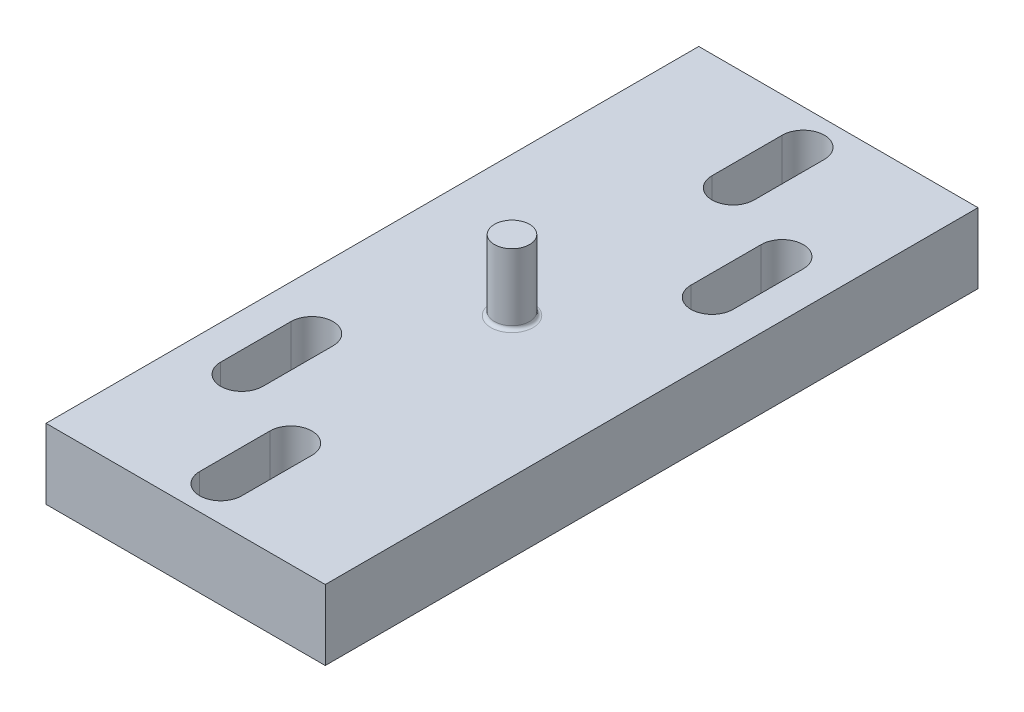
ISO-10303-21;
HEADER;
FILE_DESCRIPTION(('STEP AP214'),'2;1');
FILE_NAME('part.step','',(''),(''),'','','');
FILE_SCHEMA(('AUTOMOTIVE_DESIGN { 1 0 10303 214 1 1 1 1 }'));
ENDSEC;
DATA;
#1=APPLICATION_CONTEXT('core data for automotive mechanical design processes');
#2=APPLICATION_PROTOCOL_DEFINITION('international standard','automotive_design',2000,#1);
#3=PRODUCT_CONTEXT('',#1,'mechanical');
#4=PRODUCT('Part','Part','',(#3));
#5=PRODUCT_RELATED_PRODUCT_CATEGORY('part','',(#4));
#6=PRODUCT_DEFINITION_FORMATION('','',#4);
#7=PRODUCT_DEFINITION_CONTEXT('part definition',#1,'design');
#8=PRODUCT_DEFINITION('design','',#6,#7);
#9=PRODUCT_DEFINITION_SHAPE('','',#8);
#10=(LENGTH_UNIT() NAMED_UNIT(*) SI_UNIT(.MILLI.,.METRE.));
#11=(NAMED_UNIT(*) PLANE_ANGLE_UNIT() SI_UNIT($,.RADIAN.));
#12=(NAMED_UNIT(*) SI_UNIT($,.STERADIAN.) SOLID_ANGLE_UNIT());
#13=UNCERTAINTY_MEASURE_WITH_UNIT(LENGTH_MEASURE(1.E-05),#10,'distance_accuracy_value','');
#14=(GEOMETRIC_REPRESENTATION_CONTEXT(3) GLOBAL_UNCERTAINTY_ASSIGNED_CONTEXT((#13)) GLOBAL_UNIT_ASSIGNED_CONTEXT((#10,
#11,#12)) REPRESENTATION_CONTEXT('',''));
#15=CARTESIAN_POINT('',(0.,0.,0.));
#16=DIRECTION('',(0.,0.,1.));
#17=DIRECTION('',(1.,0.,0.));
#18=AXIS2_PLACEMENT_3D('',#15,#16,#17);
#19=CARTESIAN_POINT('',(0.,10.,-73.));
#20=DIRECTION('',(0.,1.,0.));
#21=DIRECTION('',(0.,0.,1.));
#22=AXIS2_PLACEMENT_3D('',#19,#20,#21);
#23=PLANE('',#22);
#24=CARTESIAN_POINT('',(0.,10.,-31.5));
#25=DIRECTION('',(0.,1.,0.));
#26=DIRECTION('',(0.,0.,1.));
#27=AXIS2_PLACEMENT_3D('',#24,#25,#26);
#28=CIRCLE('',#27,3.);
#29=CARTESIAN_POINT('',(0.,10.,-28.5));
#30=VERTEX_POINT('',#29);
#31=EDGE_CURVE('E11',#30,#30,#28,.F.);
#32=ORIENTED_EDGE('',*,*,#31,.T.);
#33=EDGE_LOOP('',(#32));
#34=FACE_BOUND('',#33,.T.);
#35=CARTESIAN_POINT('',(0.,10.,-73.));
#36=DIRECTION('',(0.,1.,0.));
#37=DIRECTION('',(0.,0.,1.));
#38=AXIS2_PLACEMENT_3D('',#35,#36,#37);
#39=CIRCLE('',#38,3.);
#40=CARTESIAN_POINT('',(3.00000000000005,10.,-73.));
#41=VERTEX_POINT('',#40);
#42=CARTESIAN_POINT('',(-3.00000000000006,10.,-73.));
#43=VERTEX_POINT('',#42);
#44=EDGE_CURVE('E280',#41,#43,#39,.T.);
#45=ORIENTED_EDGE('',*,*,#44,.F.);
#46=DIRECTION('',(0.,0.,1.));
#47=VECTOR('',#46,1.);
#48=CARTESIAN_POINT('',(3.00000000000005,10.,-73.));
#49=LINE('',#48,#47);
#50=CARTESIAN_POINT('',(3.,10.,-63.));
#51=VERTEX_POINT('',#50);
#52=EDGE_CURVE('E249',#41,#51,#49,.T.);
#53=ORIENTED_EDGE('',*,*,#52,.T.);
#54=CARTESIAN_POINT('',(0.,10.,-63.));
#55=DIRECTION('',(0.,1.,0.));
#56=DIRECTION('',(0.,0.,1.));
#57=AXIS2_PLACEMENT_3D('',#54,#55,#56);
#58=CIRCLE('',#57,3.);
#59=CARTESIAN_POINT('',(-3.00000000000001,10.,-63.));
#60=VERTEX_POINT('',#59);
#61=EDGE_CURVE('E287',#60,#51,#58,.T.);
#62=ORIENTED_EDGE('',*,*,#61,.F.);
#63=DIRECTION('',(0.,0.,1.));
#64=VECTOR('',#63,1.);
#65=CARTESIAN_POINT('',(-3.00000000000006,10.,-73.));
#66=LINE('',#65,#64);
#67=EDGE_CURVE('E284',#43,#60,#66,.T.);
#68=ORIENTED_EDGE('',*,*,#67,.F.);
#69=EDGE_LOOP('',(#45,#53,#62,#68));
#70=FACE_BOUND('',#69,.T.);
#71=CARTESIAN_POINT('',(0.,10.,0.));
#72=DIRECTION('',(0.,1.,0.));
#73=DIRECTION('',(0.,0.,1.));
#74=AXIS2_PLACEMENT_3D('',#71,#72,#73);
#75=CIRCLE('',#74,3.);
#76=CARTESIAN_POINT('',(3.,10.,0.));
#77=VERTEX_POINT('',#76);
#78=CARTESIAN_POINT('',(-3.,10.,0.));
#79=VERTEX_POINT('',#78);
#80=EDGE_CURVE('E289',#77,#79,#75,.T.);
#81=ORIENTED_EDGE('',*,*,#80,.F.);
#82=DIRECTION('',(0.,0.,1.));
#83=VECTOR('',#82,1.);
#84=CARTESIAN_POINT('',(3.,10.,0.));
#85=LINE('',#84,#83);
#86=CARTESIAN_POINT('',(3.00000000000006,10.,10.));
#87=VERTEX_POINT('',#86);
#88=EDGE_CURVE('E245',#77,#87,#85,.T.);
#89=ORIENTED_EDGE('',*,*,#88,.T.);
#90=CARTESIAN_POINT('',(0.,10.,10.));
#91=DIRECTION('',(0.,1.,0.));
#92=DIRECTION('',(0.,0.,1.));
#93=AXIS2_PLACEMENT_3D('',#90,#91,#92);
#94=CIRCLE('',#93,3.);
#95=CARTESIAN_POINT('',(-3.00000000000006,10.,10.));
#96=VERTEX_POINT('',#95);
#97=EDGE_CURVE('E295',#96,#87,#94,.T.);
#98=ORIENTED_EDGE('',*,*,#97,.F.);
#99=DIRECTION('',(0.,0.,1.));
#100=VECTOR('',#99,1.);
#101=CARTESIAN_POINT('',(-3.,10.,0.));
#102=LINE('',#101,#100);
#103=EDGE_CURVE('E292',#79,#96,#102,.T.);
#104=ORIENTED_EDGE('',*,*,#103,.F.);
#105=EDGE_LOOP('',(#81,#89,#98,#104));
#106=FACE_BOUND('',#105,.T.);
#107=DIRECTION('',(1.,0.,0.));
#108=VECTOR('',#107,1.);
#109=CARTESIAN_POINT('',(-19.8937990848772,10.,-78.));
#110=LINE('',#109,#108);
#111=CARTESIAN_POINT('',(-19.8937990848772,10.,-78.));
#112=VERTEX_POINT('',#111);
#113=CARTESIAN_POINT('',(19.8937990848772,10.,-78.));
#114=VERTEX_POINT('',#113);
#115=EDGE_CURVE('E278',#112,#114,#110,.T.);
#116=ORIENTED_EDGE('',*,*,#115,.F.);
#117=DIRECTION('',(0.,0.,1.));
#118=VECTOR('',#117,1.);
#119=CARTESIAN_POINT('',(-19.8937990848772,10.,-78.));
#120=LINE('',#119,#118);
#121=CARTESIAN_POINT('',(-19.8937990848772,10.,15.));
#122=VERTEX_POINT('',#121);
#123=EDGE_CURVE('E299',#112,#122,#120,.T.);
#124=ORIENTED_EDGE('',*,*,#123,.T.);
#125=DIRECTION('',(1.,0.,0.));
#126=VECTOR('',#125,1.);
#127=CARTESIAN_POINT('',(-19.8937990848772,10.,15.));
#128=LINE('',#127,#126);
#129=CARTESIAN_POINT('',(19.8937990848772,10.,15.));
#130=VERTEX_POINT('',#129);
#131=EDGE_CURVE('E297',#122,#130,#128,.T.);
#132=ORIENTED_EDGE('',*,*,#131,.T.);
#133=DIRECTION('',(0.,0.,1.));
#134=VECTOR('',#133,1.);
#135=CARTESIAN_POINT('',(19.8937990848772,10.,-78.));
#136=LINE('',#135,#134);
#137=EDGE_CURVE('E242',#114,#130,#136,.T.);
#138=ORIENTED_EDGE('',*,*,#137,.F.);
#139=EDGE_LOOP('',(#116,#124,#132,#138));
#140=FACE_BOUND('',#139,.T.);
#141=DIRECTION('',(0.,0.,-1.));
#142=VECTOR('',#141,1.);
#143=CARTESIAN_POINT('',(15.,10.,-48.));
#144=LINE('',#143,#142);
#145=CARTESIAN_POINT('',(15.,10.,-48.));
#146=VERTEX_POINT('',#145);
#147=CARTESIAN_POINT('',(15.0000000000001,10.,-58.));
#148=VERTEX_POINT('',#147);
#149=EDGE_CURVE('E215',#146,#148,#144,.T.);
#150=ORIENTED_EDGE('',*,*,#149,.F.);
#151=CARTESIAN_POINT('',(12.,10.,-48.));
#152=DIRECTION('',(0.,1.,0.));
#153=DIRECTION('',(0.,0.,1.));
#154=AXIS2_PLACEMENT_3D('',#151,#152,#153);
#155=CIRCLE('',#154,3.);
#156=CARTESIAN_POINT('',(9.,10.,-48.));
#157=VERTEX_POINT('',#156);
#158=EDGE_CURVE('E213',#157,#146,#155,.T.);
#159=ORIENTED_EDGE('',*,*,#158,.F.);
#160=DIRECTION('',(0.,0.,1.));
#161=VECTOR('',#160,1.);
#162=CARTESIAN_POINT('',(9.,10.,-48.));
#163=LINE('',#162,#161);
#164=CARTESIAN_POINT('',(9.00000000000005,10.,-58.));
#165=VERTEX_POINT('',#164);
#166=EDGE_CURVE('E220',#165,#157,#163,.T.);
#167=ORIENTED_EDGE('',*,*,#166,.F.);
#168=CARTESIAN_POINT('',(12.0000000000001,10.,-58.));
#169=DIRECTION('',(0.,1.,0.));
#170=DIRECTION('',(0.,0.,1.));
#171=AXIS2_PLACEMENT_3D('',#168,#169,#170);
#172=CIRCLE('',#171,3.);
#173=EDGE_CURVE('E218',#148,#165,#172,.T.);
#174=ORIENTED_EDGE('',*,*,#173,.F.);
#175=EDGE_LOOP('',(#150,#159,#167,#174));
#176=FACE_BOUND('',#175,.T.);
#177=DIRECTION('',(0.,0.,1.));
#178=VECTOR('',#177,1.);
#179=CARTESIAN_POINT('',(-15.,10.,-15.));
#180=LINE('',#179,#178);
#181=CARTESIAN_POINT('',(-15.,10.,-15.));
#182=VERTEX_POINT('',#181);
#183=CARTESIAN_POINT('',(-15.0000000000001,10.,-5.));
#184=VERTEX_POINT('',#183);
#185=EDGE_CURVE('E182',#182,#184,#180,.T.);
#186=ORIENTED_EDGE('',*,*,#185,.F.);
#187=CARTESIAN_POINT('',(-12.,10.,-15.));
#188=DIRECTION('',(0.,1.,0.));
#189=DIRECTION('',(0.,0.,1.));
#190=AXIS2_PLACEMENT_3D('',#187,#188,#189);
#191=CIRCLE('',#190,3.);
#192=CARTESIAN_POINT('',(-9.00000000000001,10.,-15.));
#193=VERTEX_POINT('',#192);
#194=EDGE_CURVE('E172',#193,#182,#191,.T.);
#195=ORIENTED_EDGE('',*,*,#194,.F.);
#196=DIRECTION('',(0.,0.,-1.));
#197=VECTOR('',#196,1.);
#198=CARTESIAN_POINT('',(-9.00000000000001,10.,-15.));
#199=LINE('',#198,#197);
#200=CARTESIAN_POINT('',(-9.00000000000007,10.,-5.));
#201=VERTEX_POINT('',#200);
#202=EDGE_CURVE('E196',#201,#193,#199,.T.);
#203=ORIENTED_EDGE('',*,*,#202,.F.);
#204=CARTESIAN_POINT('',(-12.0000000000001,10.,-5.));
#205=DIRECTION('',(0.,1.,0.));
#206=DIRECTION('',(0.,0.,1.));
#207=AXIS2_PLACEMENT_3D('',#204,#205,#206);
#208=CIRCLE('',#207,3.);
#209=EDGE_CURVE('E194',#184,#201,#208,.T.);
#210=ORIENTED_EDGE('',*,*,#209,.F.);
#211=EDGE_LOOP('',(#186,#195,#203,#210));
#212=FACE_BOUND('',#211,.T.);
#213=ADVANCED_FACE('F34',(#34,#70,#106,#140,#176,#212),#23,.T.);
#214=CARTESIAN_POINT('',(0.,0.,-73.));
#215=DIRECTION('',(0.,1.,0.));
#216=DIRECTION('',(0.,0.,1.));
#217=AXIS2_PLACEMENT_3D('',#214,#215,#216);
#218=PLANE('',#217);
#219=CARTESIAN_POINT('',(12.,0.,-48.));
#220=DIRECTION('',(0.,1.,0.));
#221=DIRECTION('',(0.,0.,1.));
#222=AXIS2_PLACEMENT_3D('',#219,#220,#221);
#223=CIRCLE('',#222,3.);
#224=CARTESIAN_POINT('',(9.,0.,-48.));
#225=VERTEX_POINT('',#224);
#226=CARTESIAN_POINT('',(15.,0.,-48.));
#227=VERTEX_POINT('',#226);
#228=EDGE_CURVE('E223',#225,#227,#223,.T.);
#229=ORIENTED_EDGE('',*,*,#228,.T.);
#230=DIRECTION('',(0.,0.,-1.));
#231=VECTOR('',#230,1.);
#232=CARTESIAN_POINT('',(15.,0.,-48.));
#233=LINE('',#232,#231);
#234=CARTESIAN_POINT('',(15.0000000000001,0.,-58.));
#235=VERTEX_POINT('',#234);
#236=EDGE_CURVE('E226',#227,#235,#233,.T.);
#237=ORIENTED_EDGE('',*,*,#236,.T.);
#238=CARTESIAN_POINT('',(12.0000000000001,0.,-58.));
#239=DIRECTION('',(0.,1.,0.));
#240=DIRECTION('',(0.,0.,1.));
#241=AXIS2_PLACEMENT_3D('',#238,#239,#240);
#242=CIRCLE('',#241,3.);
#243=CARTESIAN_POINT('',(9.00000000000005,0.,-58.));
#244=VERTEX_POINT('',#243);
#245=EDGE_CURVE('E230',#235,#244,#242,.T.);
#246=ORIENTED_EDGE('',*,*,#245,.T.);
#247=DIRECTION('',(0.,0.,1.));
#248=VECTOR('',#247,1.);
#249=CARTESIAN_POINT('',(9.,0.,-48.));
#250=LINE('',#249,#248);
#251=EDGE_CURVE('E216',#244,#225,#250,.T.);
#252=ORIENTED_EDGE('',*,*,#251,.T.);
#253=EDGE_LOOP('',(#229,#237,#246,#252));
#254=FACE_BOUND('',#253,.T.);
#255=DIRECTION('',(0.,0.,1.));
#256=VECTOR('',#255,1.);
#257=CARTESIAN_POINT('',(3.00000000000005,0.,-73.));
#258=LINE('',#257,#256);
#259=CARTESIAN_POINT('',(3.00000000000005,0.,-73.));
#260=VERTEX_POINT('',#259);
#261=CARTESIAN_POINT('',(3.,0.,-63.));
#262=VERTEX_POINT('',#261);
#263=EDGE_CURVE('E246',#260,#262,#258,.T.);
#264=ORIENTED_EDGE('',*,*,#263,.F.);
#265=CARTESIAN_POINT('',(0.,0.,-73.));
#266=DIRECTION('',(0.,1.,0.));
#267=DIRECTION('',(0.,0.,1.));
#268=AXIS2_PLACEMENT_3D('',#265,#266,#267);
#269=CIRCLE('',#268,3.);
#270=CARTESIAN_POINT('',(-3.00000000000006,0.,-73.));
#271=VERTEX_POINT('',#270);
#272=EDGE_CURVE('E303',#260,#271,#269,.T.);
#273=ORIENTED_EDGE('',*,*,#272,.T.);
#274=DIRECTION('',(0.,0.,1.));
#275=VECTOR('',#274,1.);
#276=CARTESIAN_POINT('',(-3.00000000000006,0.,-73.));
#277=LINE('',#276,#275);
#278=CARTESIAN_POINT('',(-3.00000000000001,0.,-63.));
#279=VERTEX_POINT('',#278);
#280=EDGE_CURVE('E306',#271,#279,#277,.T.);
#281=ORIENTED_EDGE('',*,*,#280,.T.);
#282=CARTESIAN_POINT('',(0.,0.,-63.));
#283=DIRECTION('',(0.,1.,0.));
#284=DIRECTION('',(0.,0.,1.));
#285=AXIS2_PLACEMENT_3D('',#282,#283,#284);
#286=CIRCLE('',#285,3.);
#287=EDGE_CURVE('E309',#279,#262,#286,.T.);
#288=ORIENTED_EDGE('',*,*,#287,.T.);
#289=EDGE_LOOP('',(#264,#273,#281,#288));
#290=FACE_BOUND('',#289,.T.);
#291=DIRECTION('',(0.,0.,1.));
#292=VECTOR('',#291,1.);
#293=CARTESIAN_POINT('',(3.,0.,0.));
#294=LINE('',#293,#292);
#295=CARTESIAN_POINT('',(3.,0.,0.));
#296=VERTEX_POINT('',#295);
#297=CARTESIAN_POINT('',(3.00000000000006,0.,10.));
#298=VERTEX_POINT('',#297);
#299=EDGE_CURVE('E255',#296,#298,#294,.T.);
#300=ORIENTED_EDGE('',*,*,#299,.F.);
#301=CARTESIAN_POINT('',(0.,0.,0.));
#302=DIRECTION('',(0.,1.,0.));
#303=DIRECTION('',(0.,0.,1.));
#304=AXIS2_PLACEMENT_3D('',#301,#302,#303);
#305=CIRCLE('',#304,3.);
#306=CARTESIAN_POINT('',(-3.,0.,0.));
#307=VERTEX_POINT('',#306);
#308=EDGE_CURVE('E311',#296,#307,#305,.T.);
#309=ORIENTED_EDGE('',*,*,#308,.T.);
#310=DIRECTION('',(0.,0.,1.));
#311=VECTOR('',#310,1.);
#312=CARTESIAN_POINT('',(-3.,0.,0.));
#313=LINE('',#312,#311);
#314=CARTESIAN_POINT('',(-3.00000000000006,0.,10.));
#315=VERTEX_POINT('',#314);
#316=EDGE_CURVE('E314',#307,#315,#313,.T.);
#317=ORIENTED_EDGE('',*,*,#316,.T.);
#318=CARTESIAN_POINT('',(0.,0.,10.));
#319=DIRECTION('',(0.,1.,0.));
#320=DIRECTION('',(0.,0.,1.));
#321=AXIS2_PLACEMENT_3D('',#318,#319,#320);
#322=CIRCLE('',#321,3.);
#323=EDGE_CURVE('E317',#315,#298,#322,.T.);
#324=ORIENTED_EDGE('',*,*,#323,.T.);
#325=EDGE_LOOP('',(#300,#309,#317,#324));
#326=FACE_BOUND('',#325,.T.);
#327=DIRECTION('',(1.,0.,0.));
#328=VECTOR('',#327,1.);
#329=CARTESIAN_POINT('',(-19.8937990848772,0.,-78.));
#330=LINE('',#329,#328);
#331=CARTESIAN_POINT('',(-19.8937990848772,0.,-78.));
#332=VERTEX_POINT('',#331);
#333=CARTESIAN_POINT('',(19.8937990848772,0.,-78.));
#334=VERTEX_POINT('',#333);
#335=EDGE_CURVE('E263',#332,#334,#330,.T.);
#336=ORIENTED_EDGE('',*,*,#335,.T.);
#337=DIRECTION('',(0.,0.,1.));
#338=VECTOR('',#337,1.);
#339=CARTESIAN_POINT('',(19.8937990848772,0.,-78.));
#340=LINE('',#339,#338);
#341=CARTESIAN_POINT('',(19.8937990848772,0.,15.));
#342=VERTEX_POINT('',#341);
#343=EDGE_CURVE('E190',#334,#342,#340,.T.);
#344=ORIENTED_EDGE('',*,*,#343,.T.);
#345=DIRECTION('',(1.,0.,0.));
#346=VECTOR('',#345,1.);
#347=CARTESIAN_POINT('',(-19.8937990848772,0.,15.));
#348=LINE('',#347,#346);
#349=CARTESIAN_POINT('',(-19.8937990848772,0.,15.));
#350=VERTEX_POINT('',#349);
#351=EDGE_CURVE('E319',#350,#342,#348,.T.);
#352=ORIENTED_EDGE('',*,*,#351,.F.);
#353=DIRECTION('',(0.,0.,1.));
#354=VECTOR('',#353,1.);
#355=CARTESIAN_POINT('',(-19.8937990848772,0.,-78.));
#356=LINE('',#355,#354);
#357=EDGE_CURVE('E281',#332,#350,#356,.T.);
#358=ORIENTED_EDGE('',*,*,#357,.F.);
#359=EDGE_LOOP('',(#336,#344,#352,#358));
#360=FACE_BOUND('',#359,.T.);
#361=CARTESIAN_POINT('',(-12.,0.,-15.));
#362=DIRECTION('',(0.,1.,0.));
#363=DIRECTION('',(0.,0.,1.));
#364=AXIS2_PLACEMENT_3D('',#361,#362,#363);
#365=CIRCLE('',#364,3.);
#366=CARTESIAN_POINT('',(-9.00000000000001,0.,-15.));
#367=VERTEX_POINT('',#366);
#368=CARTESIAN_POINT('',(-15.,0.,-15.));
#369=VERTEX_POINT('',#368);
#370=EDGE_CURVE('E201',#367,#369,#365,.T.);
#371=ORIENTED_EDGE('',*,*,#370,.T.);
#372=DIRECTION('',(0.,0.,1.));
#373=VECTOR('',#372,1.);
#374=CARTESIAN_POINT('',(-15.,0.,-15.));
#375=LINE('',#374,#373);
#376=CARTESIAN_POINT('',(-15.0000000000001,0.,-5.));
#377=VERTEX_POINT('',#376);
#378=EDGE_CURVE('E189',#369,#377,#375,.T.);
#379=ORIENTED_EDGE('',*,*,#378,.T.);
#380=CARTESIAN_POINT('',(-12.0000000000001,0.,-5.));
#381=DIRECTION('',(0.,1.,0.));
#382=DIRECTION('',(0.,0.,1.));
#383=AXIS2_PLACEMENT_3D('',#380,#381,#382);
#384=CIRCLE('',#383,3.);
#385=CARTESIAN_POINT('',(-9.00000000000007,0.,-5.));
#386=VERTEX_POINT('',#385);
#387=EDGE_CURVE('E205',#377,#386,#384,.T.);
#388=ORIENTED_EDGE('',*,*,#387,.T.);
#389=DIRECTION('',(0.,0.,-1.));
#390=VECTOR('',#389,1.);
#391=CARTESIAN_POINT('',(-9.00000000000001,0.,-15.));
#392=LINE('',#391,#390);
#393=EDGE_CURVE('E183',#386,#367,#392,.T.);
#394=ORIENTED_EDGE('',*,*,#393,.T.);
#395=EDGE_LOOP('',(#371,#379,#388,#394));
#396=FACE_BOUND('',#395,.T.);
#397=ADVANCED_FACE('F349',(#254,#290,#326,#360,#396),#218,.F.);
#398=CARTESIAN_POINT('',(-19.8937990848772,10.,-78.));
#399=DIRECTION('',(0.,0.,-1.));
#400=DIRECTION('',(-1.,0.,0.));
#401=AXIS2_PLACEMENT_3D('',#398,#399,#400);
#402=PLANE('',#401);
#403=ORIENTED_EDGE('',*,*,#335,.F.);
#404=DIRECTION('',(0.,-1.,0.));
#405=VECTOR('',#404,1.);
#406=CARTESIAN_POINT('',(-19.8937990848772,10.,-78.));
#407=LINE('',#406,#405);
#408=EDGE_CURVE('E322',#112,#332,#407,.T.);
#409=ORIENTED_EDGE('',*,*,#408,.F.);
#410=ORIENTED_EDGE('',*,*,#115,.T.);
#411=DIRECTION('',(0.,-1.,0.));
#412=VECTOR('',#411,1.);
#413=CARTESIAN_POINT('',(19.8937990848772,10.,-78.));
#414=LINE('',#413,#412);
#415=EDGE_CURVE('E252',#114,#334,#414,.T.);
#416=ORIENTED_EDGE('',*,*,#415,.T.);
#417=EDGE_LOOP('',(#403,#409,#410,#416));
#418=FACE_BOUND('',#417,.T.);
#419=ADVANCED_FACE('F355',(#418),#402,.T.);
#420=CARTESIAN_POINT('',(-19.8937990848772,10.,-78.));
#421=DIRECTION('',(1.,0.,0.));
#422=DIRECTION('',(0.,0.,-1.));
#423=AXIS2_PLACEMENT_3D('',#420,#421,#422);
#424=PLANE('',#423);
#425=ORIENTED_EDGE('',*,*,#357,.T.);
#426=DIRECTION('',(0.,-1.,0.));
#427=VECTOR('',#426,1.);
#428=CARTESIAN_POINT('',(-19.8937990848772,10.,15.));
#429=LINE('',#428,#427);
#430=EDGE_CURVE('E324',#122,#350,#429,.T.);
#431=ORIENTED_EDGE('',*,*,#430,.F.);
#432=ORIENTED_EDGE('',*,*,#123,.F.);
#433=ORIENTED_EDGE('',*,*,#408,.T.);
#434=EDGE_LOOP('',(#425,#431,#432,#433));
#435=FACE_BOUND('',#434,.T.);
#436=ADVANCED_FACE('F363',(#435),#424,.F.);
#437=CARTESIAN_POINT('',(-19.8937990848772,10.,15.));
#438=DIRECTION('',(0.,0.,-1.));
#439=DIRECTION('',(-1.,0.,0.));
#440=AXIS2_PLACEMENT_3D('',#437,#438,#439);
#441=PLANE('',#440);
#442=ORIENTED_EDGE('',*,*,#351,.T.);
#443=DIRECTION('',(0.,-1.,0.));
#444=VECTOR('',#443,1.);
#445=CARTESIAN_POINT('',(19.8937990848772,10.,15.));
#446=LINE('',#445,#444);
#447=EDGE_CURVE('E273',#130,#342,#446,.T.);
#448=ORIENTED_EDGE('',*,*,#447,.F.);
#449=ORIENTED_EDGE('',*,*,#131,.F.);
#450=ORIENTED_EDGE('',*,*,#430,.T.);
#451=EDGE_LOOP('',(#442,#448,#449,#450));
#452=FACE_BOUND('',#451,.T.);
#453=ADVANCED_FACE('F366',(#452),#441,.F.);
#454=CARTESIAN_POINT('',(0.,10.,10.));
#455=DIRECTION('',(0.,-1.,0.));
#456=DIRECTION('',(0.,0.,-1.));
#457=AXIS2_PLACEMENT_3D('',#454,#455,#456);
#458=CYLINDRICAL_SURFACE('',#457,3.);
#459=ORIENTED_EDGE('',*,*,#323,.F.);
#460=DIRECTION('',(0.,-1.,0.));
#461=VECTOR('',#460,1.);
#462=CARTESIAN_POINT('',(-3.00000000000006,10.,10.));
#463=LINE('',#462,#461);
#464=EDGE_CURVE('E327',#96,#315,#463,.T.);
#465=ORIENTED_EDGE('',*,*,#464,.F.);
#466=ORIENTED_EDGE('',*,*,#97,.T.);
#467=DIRECTION('',(0.,-1.,0.));
#468=VECTOR('',#467,1.);
#469=CARTESIAN_POINT('',(3.00000000000006,10.,10.));
#470=LINE('',#469,#468);
#471=EDGE_CURVE('E270',#87,#298,#470,.T.);
#472=ORIENTED_EDGE('',*,*,#471,.T.);
#473=EDGE_LOOP('',(#459,#465,#466,#472));
#474=FACE_BOUND('',#473,.T.);
#475=ADVANCED_FACE('F370',(#474),#458,.F.);
#476=CARTESIAN_POINT('',(-3.,10.,0.));
#477=DIRECTION('',(1.,0.,0.));
#478=DIRECTION('',(0.,0.,-1.));
#479=AXIS2_PLACEMENT_3D('',#476,#477,#478);
#480=PLANE('',#479);
#481=ORIENTED_EDGE('',*,*,#316,.F.);
#482=DIRECTION('',(0.,-1.,0.));
#483=VECTOR('',#482,1.);
#484=CARTESIAN_POINT('',(-3.,10.,0.));
#485=LINE('',#484,#483);
#486=EDGE_CURVE('E329',#79,#307,#485,.T.);
#487=ORIENTED_EDGE('',*,*,#486,.F.);
#488=ORIENTED_EDGE('',*,*,#103,.T.);
#489=ORIENTED_EDGE('',*,*,#464,.T.);
#490=EDGE_LOOP('',(#481,#487,#488,#489));
#491=FACE_BOUND('',#490,.T.);
#492=ADVANCED_FACE('F374',(#491),#480,.T.);
#493=CARTESIAN_POINT('',(0.,10.,0.));
#494=DIRECTION('',(0.,-1.,0.));
#495=DIRECTION('',(0.,0.,-1.));
#496=AXIS2_PLACEMENT_3D('',#493,#494,#495);
#497=CYLINDRICAL_SURFACE('',#496,3.);
#498=ORIENTED_EDGE('',*,*,#308,.F.);
#499=DIRECTION('',(0.,-1.,0.));
#500=VECTOR('',#499,1.);
#501=CARTESIAN_POINT('',(3.,10.,0.));
#502=LINE('',#501,#500);
#503=EDGE_CURVE('E267',#77,#296,#502,.T.);
#504=ORIENTED_EDGE('',*,*,#503,.F.);
#505=ORIENTED_EDGE('',*,*,#80,.T.);
#506=ORIENTED_EDGE('',*,*,#486,.T.);
#507=EDGE_LOOP('',(#498,#504,#505,#506));
#508=FACE_BOUND('',#507,.T.);
#509=ADVANCED_FACE('F378',(#508),#497,.F.);
#510=CARTESIAN_POINT('',(0.,10.,-63.));
#511=DIRECTION('',(0.,-1.,0.));
#512=DIRECTION('',(0.,0.,-1.));
#513=AXIS2_PLACEMENT_3D('',#510,#511,#512);
#514=CYLINDRICAL_SURFACE('',#513,3.);
#515=ORIENTED_EDGE('',*,*,#287,.F.);
#516=DIRECTION('',(0.,-1.,0.));
#517=VECTOR('',#516,1.);
#518=CARTESIAN_POINT('',(-3.00000000000001,10.,-63.));
#519=LINE('',#518,#517);
#520=EDGE_CURVE('E331',#60,#279,#519,.T.);
#521=ORIENTED_EDGE('',*,*,#520,.F.);
#522=ORIENTED_EDGE('',*,*,#61,.T.);
#523=DIRECTION('',(0.,-1.,0.));
#524=VECTOR('',#523,1.);
#525=CARTESIAN_POINT('',(3.,10.,-63.));
#526=LINE('',#525,#524);
#527=EDGE_CURVE('E264',#51,#262,#526,.T.);
#528=ORIENTED_EDGE('',*,*,#527,.T.);
#529=EDGE_LOOP('',(#515,#521,#522,#528));
#530=FACE_BOUND('',#529,.T.);
#531=ADVANCED_FACE('F382',(#530),#514,.F.);
#532=CARTESIAN_POINT('',(-3.00000000000006,10.,-73.));
#533=DIRECTION('',(1.,0.,0.));
#534=DIRECTION('',(0.,0.,-1.));
#535=AXIS2_PLACEMENT_3D('',#532,#533,#534);
#536=PLANE('',#535);
#537=ORIENTED_EDGE('',*,*,#280,.F.);
#538=DIRECTION('',(0.,-1.,0.));
#539=VECTOR('',#538,1.);
#540=CARTESIAN_POINT('',(-3.00000000000006,10.,-73.));
#541=LINE('',#540,#539);
#542=EDGE_CURVE('E301',#43,#271,#541,.T.);
#543=ORIENTED_EDGE('',*,*,#542,.F.);
#544=ORIENTED_EDGE('',*,*,#67,.T.);
#545=ORIENTED_EDGE('',*,*,#520,.T.);
#546=EDGE_LOOP('',(#537,#543,#544,#545));
#547=FACE_BOUND('',#546,.T.);
#548=ADVANCED_FACE('F386',(#547),#536,.T.);
#549=CARTESIAN_POINT('',(0.,10.,-73.));
#550=DIRECTION('',(0.,-1.,0.));
#551=DIRECTION('',(0.,0.,-1.));
#552=AXIS2_PLACEMENT_3D('',#549,#550,#551);
#553=CYLINDRICAL_SURFACE('',#552,3.);
#554=ORIENTED_EDGE('',*,*,#272,.F.);
#555=DIRECTION('',(0.,-1.,0.));
#556=VECTOR('',#555,1.);
#557=CARTESIAN_POINT('',(3.00000000000005,10.,-73.));
#558=LINE('',#557,#556);
#559=EDGE_CURVE('E260',#41,#260,#558,.T.);
#560=ORIENTED_EDGE('',*,*,#559,.F.);
#561=ORIENTED_EDGE('',*,*,#44,.T.);
#562=ORIENTED_EDGE('',*,*,#542,.T.);
#563=EDGE_LOOP('',(#554,#560,#561,#562));
#564=FACE_BOUND('',#563,.T.);
#565=ADVANCED_FACE('F390',(#564),#553,.F.);
#566=CARTESIAN_POINT('',(3.00000000000005,10.,-73.));
#567=DIRECTION('',(1.,0.,0.));
#568=DIRECTION('',(0.,0.,-1.));
#569=AXIS2_PLACEMENT_3D('',#566,#567,#568);
#570=PLANE('',#569);
#571=ORIENTED_EDGE('',*,*,#263,.T.);
#572=ORIENTED_EDGE('',*,*,#527,.F.);
#573=ORIENTED_EDGE('',*,*,#52,.F.);
#574=ORIENTED_EDGE('',*,*,#559,.T.);
#575=EDGE_LOOP('',(#571,#572,#573,#574));
#576=FACE_BOUND('',#575,.T.);
#577=ADVANCED_FACE('F393',(#576),#570,.F.);
#578=CARTESIAN_POINT('',(3.,10.,0.));
#579=DIRECTION('',(1.,0.,0.));
#580=DIRECTION('',(0.,0.,-1.));
#581=AXIS2_PLACEMENT_3D('',#578,#579,#580);
#582=PLANE('',#581);
#583=ORIENTED_EDGE('',*,*,#299,.T.);
#584=ORIENTED_EDGE('',*,*,#471,.F.);
#585=ORIENTED_EDGE('',*,*,#88,.F.);
#586=ORIENTED_EDGE('',*,*,#503,.T.);
#587=EDGE_LOOP('',(#583,#584,#585,#586));
#588=FACE_BOUND('',#587,.T.);
#589=ADVANCED_FACE('F417',(#588),#582,.F.);
#590=CARTESIAN_POINT('',(19.8937990848772,10.,-78.));
#591=DIRECTION('',(1.,0.,0.));
#592=DIRECTION('',(0.,0.,-1.));
#593=AXIS2_PLACEMENT_3D('',#590,#591,#592);
#594=PLANE('',#593);
#595=ORIENTED_EDGE('',*,*,#343,.F.);
#596=ORIENTED_EDGE('',*,*,#415,.F.);
#597=ORIENTED_EDGE('',*,*,#137,.T.);
#598=ORIENTED_EDGE('',*,*,#447,.T.);
#599=EDGE_LOOP('',(#595,#596,#597,#598));
#600=FACE_BOUND('',#599,.T.);
#601=ADVANCED_FACE('F360',(#600),#594,.T.);
#602=CARTESIAN_POINT('',(12.,10.,-48.));
#603=DIRECTION('',(0.,-1.,0.));
#604=DIRECTION('',(0.,0.,-1.));
#605=AXIS2_PLACEMENT_3D('',#602,#603,#604);
#606=CYLINDRICAL_SURFACE('',#605,3.);
#607=ORIENTED_EDGE('',*,*,#228,.F.);
#608=DIRECTION('',(0.,-1.,0.));
#609=VECTOR('',#608,1.);
#610=CARTESIAN_POINT('',(9.,10.,-48.));
#611=LINE('',#610,#609);
#612=EDGE_CURVE('E222',#157,#225,#611,.T.);
#613=ORIENTED_EDGE('',*,*,#612,.F.);
#614=ORIENTED_EDGE('',*,*,#158,.T.);
#615=DIRECTION('',(0.,-1.,0.));
#616=VECTOR('',#615,1.);
#617=CARTESIAN_POINT('',(15.,10.,-48.));
#618=LINE('',#617,#616);
#619=EDGE_CURVE('E203',#146,#227,#618,.T.);
#620=ORIENTED_EDGE('',*,*,#619,.T.);
#621=EDGE_LOOP('',(#607,#613,#614,#620));
#622=FACE_BOUND('',#621,.T.);
#623=ADVANCED_FACE('F416',(#622),#606,.F.);
#624=CARTESIAN_POINT('',(15.,10.,-48.));
#625=DIRECTION('',(-1.,0.,0.));
#626=DIRECTION('',(0.,0.,1.));
#627=AXIS2_PLACEMENT_3D('',#624,#625,#626);
#628=PLANE('',#627);
#629=ORIENTED_EDGE('',*,*,#236,.F.);
#630=ORIENTED_EDGE('',*,*,#619,.F.);
#631=ORIENTED_EDGE('',*,*,#149,.T.);
#632=DIRECTION('',(0.,-1.,0.));
#633=VECTOR('',#632,1.);
#634=CARTESIAN_POINT('',(15.0000000000001,10.,-58.));
#635=LINE('',#634,#633);
#636=EDGE_CURVE('E238',#148,#235,#635,.T.);
#637=ORIENTED_EDGE('',*,*,#636,.T.);
#638=EDGE_LOOP('',(#629,#630,#631,#637));
#639=FACE_BOUND('',#638,.T.);
#640=ADVANCED_FACE('F422',(#639),#628,.T.);
#641=CARTESIAN_POINT('',(12.0000000000001,10.,-58.));
#642=DIRECTION('',(0.,-1.,0.));
#643=DIRECTION('',(0.,0.,-1.));
#644=AXIS2_PLACEMENT_3D('',#641,#642,#643);
#645=CYLINDRICAL_SURFACE('',#644,3.);
#646=ORIENTED_EDGE('',*,*,#245,.F.);
#647=ORIENTED_EDGE('',*,*,#636,.F.);
#648=ORIENTED_EDGE('',*,*,#173,.T.);
#649=DIRECTION('',(0.,-1.,0.));
#650=VECTOR('',#649,1.);
#651=CARTESIAN_POINT('',(9.00000000000005,10.,-58.));
#652=LINE('',#651,#650);
#653=EDGE_CURVE('E57',#165,#244,#652,.T.);
#654=ORIENTED_EDGE('',*,*,#653,.T.);
#655=EDGE_LOOP('',(#646,#647,#648,#654));
#656=FACE_BOUND('',#655,.T.);
#657=ADVANCED_FACE('F434',(#656),#645,.F.);
#658=CARTESIAN_POINT('',(9.,10.,-48.));
#659=DIRECTION('',(1.,0.,0.));
#660=DIRECTION('',(0.,0.,-1.));
#661=AXIS2_PLACEMENT_3D('',#658,#659,#660);
#662=PLANE('',#661);
#663=ORIENTED_EDGE('',*,*,#251,.F.);
#664=ORIENTED_EDGE('',*,*,#653,.F.);
#665=ORIENTED_EDGE('',*,*,#166,.T.);
#666=ORIENTED_EDGE('',*,*,#612,.T.);
#667=EDGE_LOOP('',(#663,#664,#665,#666));
#668=FACE_BOUND('',#667,.T.);
#669=ADVANCED_FACE('F438',(#668),#662,.T.);
#670=CARTESIAN_POINT('',(-12.,10.,-15.));
#671=DIRECTION('',(0.,-1.,0.));
#672=DIRECTION('',(0.,0.,-1.));
#673=AXIS2_PLACEMENT_3D('',#670,#671,#672);
#674=CYLINDRICAL_SURFACE('',#673,3.);
#675=ORIENTED_EDGE('',*,*,#370,.F.);
#676=DIRECTION('',(0.,-1.,0.));
#677=VECTOR('',#676,1.);
#678=CARTESIAN_POINT('',(-9.00000000000001,10.,-15.));
#679=LINE('',#678,#677);
#680=EDGE_CURVE('E178',#193,#367,#679,.T.);
#681=ORIENTED_EDGE('',*,*,#680,.F.);
#682=ORIENTED_EDGE('',*,*,#194,.T.);
#683=DIRECTION('',(0.,-1.,0.));
#684=VECTOR('',#683,1.);
#685=CARTESIAN_POINT('',(-15.,10.,-15.));
#686=LINE('',#685,#684);
#687=EDGE_CURVE('E175',#182,#369,#686,.T.);
#688=ORIENTED_EDGE('',*,*,#687,.T.);
#689=EDGE_LOOP('',(#675,#681,#682,#688));
#690=FACE_BOUND('',#689,.T.);
#691=ADVANCED_FACE('F174',(#690),#674,.F.);
#692=CARTESIAN_POINT('',(-15.,10.,-15.));
#693=DIRECTION('',(1.,0.,0.));
#694=DIRECTION('',(0.,0.,-1.));
#695=AXIS2_PLACEMENT_3D('',#692,#693,#694);
#696=PLANE('',#695);
#697=ORIENTED_EDGE('',*,*,#378,.F.);
#698=ORIENTED_EDGE('',*,*,#687,.F.);
#699=ORIENTED_EDGE('',*,*,#185,.T.);
#700=DIRECTION('',(0.,-1.,0.));
#701=VECTOR('',#700,1.);
#702=CARTESIAN_POINT('',(-15.0000000000001,10.,-5.));
#703=LINE('',#702,#701);
#704=EDGE_CURVE('E191',#184,#377,#703,.T.);
#705=ORIENTED_EDGE('',*,*,#704,.T.);
#706=EDGE_LOOP('',(#697,#698,#699,#705));
#707=FACE_BOUND('',#706,.T.);
#708=ADVANCED_FACE('F186',(#707),#696,.T.);
#709=CARTESIAN_POINT('',(-12.0000000000001,10.,-5.));
#710=DIRECTION('',(0.,-1.,0.));
#711=DIRECTION('',(0.,0.,-1.));
#712=AXIS2_PLACEMENT_3D('',#709,#710,#711);
#713=CYLINDRICAL_SURFACE('',#712,3.);
#714=ORIENTED_EDGE('',*,*,#387,.F.);
#715=ORIENTED_EDGE('',*,*,#704,.F.);
#716=ORIENTED_EDGE('',*,*,#209,.T.);
#717=DIRECTION('',(0.,-1.,0.));
#718=VECTOR('',#717,1.);
#719=CARTESIAN_POINT('',(-9.00000000000007,10.,-5.));
#720=LINE('',#719,#718);
#721=EDGE_CURVE('E49',#201,#386,#720,.T.);
#722=ORIENTED_EDGE('',*,*,#721,.T.);
#723=EDGE_LOOP('',(#714,#715,#716,#722));
#724=FACE_BOUND('',#723,.T.);
#725=ADVANCED_FACE('F446',(#724),#713,.F.);
#726=CARTESIAN_POINT('',(-9.00000000000001,10.,-15.));
#727=DIRECTION('',(-1.,0.,0.));
#728=DIRECTION('',(0.,0.,1.));
#729=AXIS2_PLACEMENT_3D('',#726,#727,#728);
#730=PLANE('',#729);
#731=ORIENTED_EDGE('',*,*,#393,.F.);
#732=ORIENTED_EDGE('',*,*,#721,.F.);
#733=ORIENTED_EDGE('',*,*,#202,.T.);
#734=ORIENTED_EDGE('',*,*,#680,.T.);
#735=EDGE_LOOP('',(#731,#732,#733,#734));
#736=FACE_BOUND('',#735,.T.);
#737=ADVANCED_FACE('F449',(#736),#730,.T.);
#738=CARTESIAN_POINT('',(0.,20.,-31.5));
#739=DIRECTION('',(0.,-1.,0.));
#740=DIRECTION('',(0.,0.,-1.));
#741=AXIS2_PLACEMENT_3D('',#738,#739,#740);
#742=CYLINDRICAL_SURFACE('',#741,2.5);
#743=CARTESIAN_POINT('',(0.,10.5,-31.5));
#744=DIRECTION('',(0.,1.,0.));
#745=DIRECTION('',(0.,0.,1.));
#746=AXIS2_PLACEMENT_3D('',#743,#744,#745);
#747=CIRCLE('',#746,2.5);
#748=CARTESIAN_POINT('',(0.,10.5,-29.));
#749=VERTEX_POINT('',#748);
#750=EDGE_CURVE('E42',#749,#749,#747,.T.);
#751=ORIENTED_EDGE('',*,*,#750,.T.);
#752=EDGE_LOOP('',(#751));
#753=FACE_BOUND('',#752,.T.);
#754=CARTESIAN_POINT('',(0.,20.,-31.5));
#755=DIRECTION('',(0.,1.,0.));
#756=DIRECTION('',(0.,0.,1.));
#757=AXIS2_PLACEMENT_3D('',#754,#755,#756);
#758=CIRCLE('',#757,2.5);
#759=CARTESIAN_POINT('',(0.,20.,-29.));
#760=VERTEX_POINT('',#759);
#761=EDGE_CURVE('E227',#760,#760,#758,.T.);
#762=ORIENTED_EDGE('',*,*,#761,.F.);
#763=EDGE_LOOP('',(#762));
#764=FACE_BOUND('',#763,.T.);
#765=ADVANCED_FACE('F336',(#753,#764),#742,.T.);
#766=CARTESIAN_POINT('',(0.,20.,-31.5));
#767=DIRECTION('',(0.,1.,0.));
#768=DIRECTION('',(0.,0.,1.));
#769=AXIS2_PLACEMENT_3D('',#766,#767,#768);
#770=PLANE('',#769);
#771=ORIENTED_EDGE('',*,*,#761,.T.);
#772=EDGE_LOOP('',(#771));
#773=FACE_BOUND('',#772,.T.);
#774=ADVANCED_FACE('F340',(#773),#770,.T.);
#775=CARTESIAN_POINT('',(0.,10.5,-31.5));
#776=DIRECTION('',(0.,1.,0.));
#777=DIRECTION('',(0.,0.,1.));
#778=AXIS2_PLACEMENT_3D('',#775,#776,#777);
#779=TOROIDAL_SURFACE('',#778,3.,0.5);
#780=ORIENTED_EDGE('',*,*,#31,.F.);
#781=EDGE_LOOP('',(#780));
#782=FACE_BOUND('',#781,.T.);
#783=ORIENTED_EDGE('',*,*,#750,.F.);
#784=EDGE_LOOP('',(#783));
#785=FACE_BOUND('',#784,.T.);
#786=ADVANCED_FACE('F36',(#782,#785),#779,.F.);
#787=CLOSED_SHELL('',(#213,#397,#419,#436,#453,#475,#492,#509,#531,#548,#565,#577,#589,#601,
#623,#640,#657,#669,#691,#708,#725,#737,#765,#774,#786));
#788=MANIFOLD_SOLID_BREP('B2',#787);
#789=ADVANCED_BREP_SHAPE_REPRESENTATION('',(#18,#788),#14);
#790=SHAPE_DEFINITION_REPRESENTATION(#9,#789);
ENDSEC;
END-ISO-10303-21;
